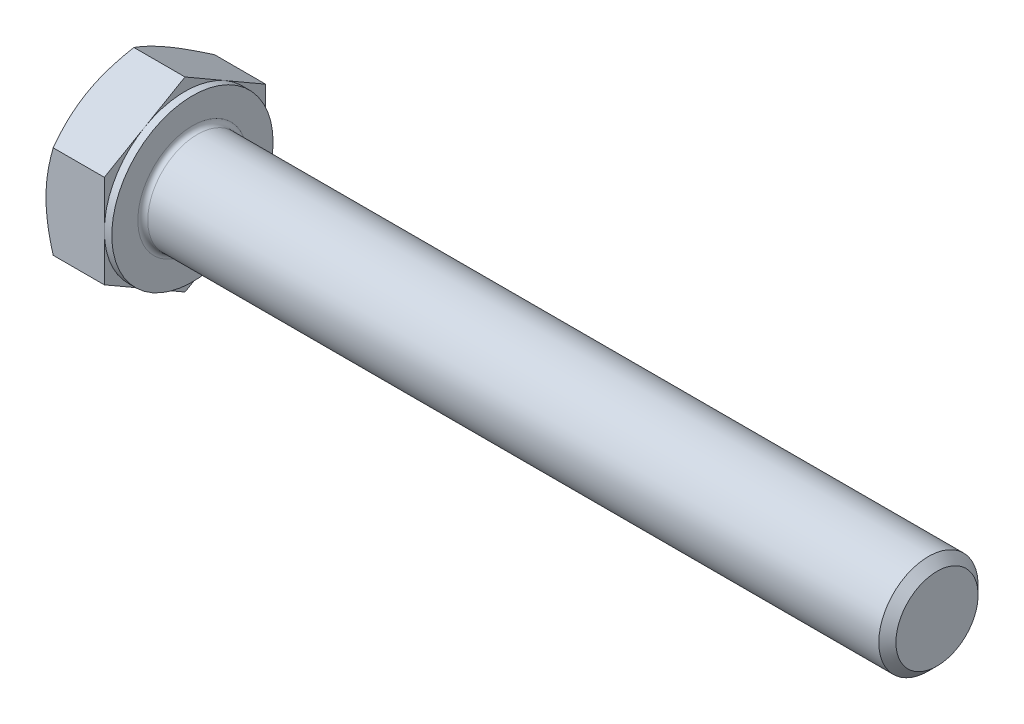
ISO-10303-21;
HEADER;
FILE_DESCRIPTION(('STEP AP214'),'2;1');
FILE_NAME('part.step','',(''),(''),'','','');
FILE_SCHEMA(('AUTOMOTIVE_DESIGN { 1 0 10303 214 1 1 1 1 }'));
ENDSEC;
DATA;
#1=APPLICATION_CONTEXT('core data for automotive mechanical design processes');
#2=APPLICATION_PROTOCOL_DEFINITION('international standard','automotive_design',2000,#1);
#3=PRODUCT_CONTEXT('',#1,'mechanical');
#4=PRODUCT('Part','Part','',(#3));
#5=PRODUCT_RELATED_PRODUCT_CATEGORY('part','',(#4));
#6=PRODUCT_DEFINITION_FORMATION('','',#4);
#7=PRODUCT_DEFINITION_CONTEXT('part definition',#1,'design');
#8=PRODUCT_DEFINITION('design','',#6,#7);
#9=PRODUCT_DEFINITION_SHAPE('','',#8);
#10=(LENGTH_UNIT() NAMED_UNIT(*) SI_UNIT(.MILLI.,.METRE.));
#11=(NAMED_UNIT(*) PLANE_ANGLE_UNIT() SI_UNIT($,.RADIAN.));
#12=(NAMED_UNIT(*) SI_UNIT($,.STERADIAN.) SOLID_ANGLE_UNIT());
#13=UNCERTAINTY_MEASURE_WITH_UNIT(LENGTH_MEASURE(1.E-05),#10,'distance_accuracy_value','');
#14=(GEOMETRIC_REPRESENTATION_CONTEXT(3) GLOBAL_UNCERTAINTY_ASSIGNED_CONTEXT((#13)) GLOBAL_UNIT_ASSIGNED_CONTEXT((#10,
#11,#12)) REPRESENTATION_CONTEXT('',''));
#15=CARTESIAN_POINT('',(0.,0.,0.));
#16=DIRECTION('',(0.,0.,1.));
#17=DIRECTION('',(1.,0.,0.));
#18=AXIS2_PLACEMENT_3D('',#15,#16,#17);
#19=CARTESIAN_POINT('',(5.3,7.50555349946514,0.));
#20=DIRECTION('',(1.,0.,0.));
#21=DIRECTION('',(0.,0.,-1.));
#22=AXIS2_PLACEMENT_3D('',#19,#20,#21);
#23=PLANE('',#22);
#24=CARTESIAN_POINT('',(5.3,0.,0.));
#25=DIRECTION('',(1.,0.,0.));
#26=DIRECTION('',(0.,0.,-1.));
#27=AXIS2_PLACEMENT_3D('',#24,#25,#26);
#28=CIRCLE('',#27,4.4);
#29=CARTESIAN_POINT('',(5.3,0.,-4.4));
#30=VERTEX_POINT('',#29);
#31=EDGE_CURVE('E42',#30,#30,#28,.F.);
#32=ORIENTED_EDGE('',*,*,#31,.T.);
#33=EDGE_LOOP('',(#32));
#34=FACE_BOUND('',#33,.T.);
#35=CARTESIAN_POINT('',(5.3,0.,0.));
#36=DIRECTION('',(1.,0.,0.));
#37=DIRECTION('',(0.,0.,-1.));
#38=AXIS2_PLACEMENT_3D('',#35,#36,#37);
#39=CIRCLE('',#38,6.5);
#40=CARTESIAN_POINT('',(5.3,0.,-6.5));
#41=VERTEX_POINT('',#40);
#42=EDGE_CURVE('E299',#41,#41,#39,.T.);
#43=ORIENTED_EDGE('',*,*,#42,.T.);
#44=EDGE_LOOP('',(#43));
#45=FACE_BOUND('',#44,.T.);
#46=ADVANCED_FACE('F34',(#34,#45),#23,.T.);
#47=CARTESIAN_POINT('',(0.,0.,0.));
#48=DIRECTION('',(-1.,0.,0.));
#49=DIRECTION('',(0.,0.,1.));
#50=AXIS2_PLACEMENT_3D('',#47,#48,#49);
#51=CYLINDRICAL_SURFACE('',#50,4.);
#52=CARTESIAN_POINT('',(5.7,0.,0.));
#53=DIRECTION('',(1.,0.,0.));
#54=DIRECTION('',(0.,0.,-1.));
#55=AXIS2_PLACEMENT_3D('',#52,#53,#54);
#56=CIRCLE('',#55,4.);
#57=CARTESIAN_POINT('',(5.7,0.,-4.));
#58=VERTEX_POINT('',#57);
#59=EDGE_CURVE('E11',#58,#58,#56,.T.);
#60=ORIENTED_EDGE('',*,*,#59,.T.);
#61=EDGE_LOOP('',(#60));
#62=FACE_BOUND('',#61,.T.);
#63=CARTESIAN_POINT('',(64.6095,0.,0.));
#64=DIRECTION('',(-1.,0.,0.));
#65=DIRECTION('',(0.,0.,1.));
#66=AXIS2_PLACEMENT_3D('',#63,#64,#65);
#67=CIRCLE('',#66,4.);
#68=CARTESIAN_POINT('',(64.6095,0.,4.));
#69=VERTEX_POINT('',#68);
#70=EDGE_CURVE('E278',#69,#69,#67,.T.);
#71=ORIENTED_EDGE('',*,*,#70,.T.);
#72=EDGE_LOOP('',(#71));
#73=FACE_BOUND('',#72,.T.);
#74=ADVANCED_FACE('F252',(#62,#73),#51,.T.);
#75=CARTESIAN_POINT('',(65.3,0.,0.));
#76=DIRECTION('',(-1.,0.,0.));
#77=DIRECTION('',(0.,0.,1.));
#78=AXIS2_PLACEMENT_3D('',#75,#76,#77);
#79=CONICAL_SURFACE('',#78,3.3095,0.785398163397461);
#80=ORIENTED_EDGE('',*,*,#70,.F.);
#81=EDGE_LOOP('',(#80));
#82=FACE_BOUND('',#81,.T.);
#83=CARTESIAN_POINT('',(65.3,0.,0.));
#84=DIRECTION('',(-1.,0.,0.));
#85=DIRECTION('',(0.,0.,1.));
#86=AXIS2_PLACEMENT_3D('',#83,#84,#85);
#87=CIRCLE('',#86,3.3095);
#88=CARTESIAN_POINT('',(65.3,0.,3.3095));
#89=VERTEX_POINT('',#88);
#90=EDGE_CURVE('E276',#89,#89,#87,.T.);
#91=ORIENTED_EDGE('',*,*,#90,.T.);
#92=EDGE_LOOP('',(#91));
#93=FACE_BOUND('',#92,.T.);
#94=ADVANCED_FACE('F257',(#82,#93),#79,.T.);
#95=CARTESIAN_POINT('',(65.3,0.,0.));
#96=DIRECTION('',(-1.,0.,0.));
#97=DIRECTION('',(0.,0.,1.));
#98=AXIS2_PLACEMENT_3D('',#95,#96,#97);
#99=PLANE('',#98);
#100=ORIENTED_EDGE('',*,*,#90,.F.);
#101=EDGE_LOOP('',(#100));
#102=FACE_BOUND('',#101,.T.);
#103=ADVANCED_FACE('F264',(#102),#99,.F.);
#104=CARTESIAN_POINT('',(4.7,6.5,0.));
#105=DIRECTION('',(1.,0.,0.));
#106=DIRECTION('',(0.,0.,-1.));
#107=AXIS2_PLACEMENT_3D('',#104,#105,#106);
#108=PLANE('',#107);
#109=DIRECTION('',(0.,0.500000000000001,0.866025403784438));
#110=VECTOR('',#109,1.);
#111=CARTESIAN_POINT('',(4.7,3.75277674973256,-6.5));
#112=LINE('',#111,#110);
#113=CARTESIAN_POINT('',(4.7,3.75277674973256,-6.5));
#114=VERTEX_POINT('',#113);
#115=CARTESIAN_POINT('',(4.7,5.62916512459885,-3.25000000000001));
#116=VERTEX_POINT('',#115);
#117=EDGE_CURVE('E166',#114,#116,#112,.T.);
#118=ORIENTED_EDGE('',*,*,#117,.T.);
#119=CARTESIAN_POINT('',(4.7,0.,0.));
#120=DIRECTION('',(-1.,0.,0.));
#121=DIRECTION('',(0.,0.,1.));
#122=AXIS2_PLACEMENT_3D('',#119,#120,#121);
#123=CIRCLE('',#122,6.5);
#124=CARTESIAN_POINT('',(4.7,0.,-6.5));
#125=VERTEX_POINT('',#124);
#126=EDGE_CURVE('E49',#116,#125,#123,.T.);
#127=ORIENTED_EDGE('',*,*,#126,.T.);
#128=DIRECTION('',(0.,1.,0.));
#129=VECTOR('',#128,1.);
#130=CARTESIAN_POINT('',(4.7,3.75277674973256,-6.5));
#131=LINE('',#130,#129);
#132=EDGE_CURVE('E302',#125,#114,#131,.T.);
#133=ORIENTED_EDGE('',*,*,#132,.T.);
#134=EDGE_LOOP('',(#118,#127,#133));
#135=FACE_BOUND('',#134,.T.);
#136=ADVANCED_FACE('F267',(#135),#108,.T.);
#137=CARTESIAN_POINT('',(4.7,7.50555349946514,0.));
#138=VERTEX_POINT('',#137);
#139=EDGE_CURVE('E164',#116,#138,#112,.T.);
#140=ORIENTED_EDGE('',*,*,#139,.T.);
#141=DIRECTION('',(0.,-0.500000000000001,0.866025403784438));
#142=VECTOR('',#141,1.);
#143=CARTESIAN_POINT('',(4.7,7.50555349946514,0.));
#144=LINE('',#143,#142);
#145=CARTESIAN_POINT('',(4.7,5.62916512459885,3.25000000000001));
#146=VERTEX_POINT('',#145);
#147=EDGE_CURVE('E163',#138,#146,#144,.T.);
#148=ORIENTED_EDGE('',*,*,#147,.T.);
#149=EDGE_CURVE('E152',#146,#116,#123,.T.);
#150=ORIENTED_EDGE('',*,*,#149,.T.);
#151=EDGE_LOOP('',(#140,#148,#150));
#152=FACE_BOUND('',#151,.T.);
#153=ADVANCED_FACE('F272',(#152),#108,.T.);
#154=CARTESIAN_POINT('',(4.7,3.75277674973256,6.5));
#155=VERTEX_POINT('',#154);
#156=EDGE_CURVE('E131',#146,#155,#144,.T.);
#157=ORIENTED_EDGE('',*,*,#156,.T.);
#158=DIRECTION('',(0.,-1.,0.));
#159=VECTOR('',#158,1.);
#160=CARTESIAN_POINT('',(4.7,3.75277674973256,6.5));
#161=LINE('',#160,#159);
#162=CARTESIAN_POINT('',(4.7,0.,6.5));
#163=VERTEX_POINT('',#162);
#164=EDGE_CURVE('E125',#155,#163,#161,.T.);
#165=ORIENTED_EDGE('',*,*,#164,.T.);
#166=EDGE_CURVE('E129',#163,#146,#123,.T.);
#167=ORIENTED_EDGE('',*,*,#166,.T.);
#168=EDGE_LOOP('',(#157,#165,#167));
#169=FACE_BOUND('',#168,.T.);
#170=ADVANCED_FACE('F127',(#169),#108,.T.);
#171=CARTESIAN_POINT('',(4.7,-3.75277674973255,6.5));
#172=VERTEX_POINT('',#171);
#173=EDGE_CURVE('E135',#163,#172,#161,.T.);
#174=ORIENTED_EDGE('',*,*,#173,.T.);
#175=DIRECTION('',(0.,-0.500000000000002,-0.866025403784437));
#176=VECTOR('',#175,1.);
#177=CARTESIAN_POINT('',(4.7,-7.50555349946514,0.));
#178=LINE('',#177,#176);
#179=CARTESIAN_POINT('',(4.7,-5.62916512459885,3.25000000000001));
#180=VERTEX_POINT('',#179);
#181=EDGE_CURVE('E142',#172,#180,#178,.T.);
#182=ORIENTED_EDGE('',*,*,#181,.T.);
#183=EDGE_CURVE('E139',#180,#163,#123,.T.);
#184=ORIENTED_EDGE('',*,*,#183,.T.);
#185=EDGE_LOOP('',(#174,#182,#184));
#186=FACE_BOUND('',#185,.T.);
#187=ADVANCED_FACE('F140',(#186),#108,.T.);
#188=CARTESIAN_POINT('',(4.7,-7.50555349946514,0.));
#189=VERTEX_POINT('',#188);
#190=EDGE_CURVE('E158',#180,#189,#178,.T.);
#191=ORIENTED_EDGE('',*,*,#190,.T.);
#192=DIRECTION('',(0.,0.5,-0.866025403784439));
#193=VECTOR('',#192,1.);
#194=CARTESIAN_POINT('',(4.7,-3.75277674973257,-6.5));
#195=LINE('',#194,#193);
#196=CARTESIAN_POINT('',(4.7,-5.62916512459885,-3.25));
#197=VERTEX_POINT('',#196);
#198=EDGE_CURVE('E340',#189,#197,#195,.T.);
#199=ORIENTED_EDGE('',*,*,#198,.T.);
#200=EDGE_CURVE('E146',#197,#180,#123,.T.);
#201=ORIENTED_EDGE('',*,*,#200,.T.);
#202=EDGE_LOOP('',(#191,#199,#201));
#203=FACE_BOUND('',#202,.T.);
#204=ADVANCED_FACE('F341',(#203),#108,.T.);
#205=CARTESIAN_POINT('',(4.7,-3.75277674973257,-6.5));
#206=VERTEX_POINT('',#205);
#207=EDGE_CURVE('E153',#197,#206,#195,.T.);
#208=ORIENTED_EDGE('',*,*,#207,.T.);
#209=EDGE_CURVE('E303',#206,#125,#131,.T.);
#210=ORIENTED_EDGE('',*,*,#209,.T.);
#211=EDGE_CURVE('E310',#125,#197,#123,.T.);
#212=ORIENTED_EDGE('',*,*,#211,.T.);
#213=EDGE_LOOP('',(#208,#210,#212));
#214=FACE_BOUND('',#213,.T.);
#215=ADVANCED_FACE('F273',(#214),#108,.T.);
#216=CARTESIAN_POINT('',(0.,0.,0.));
#217=DIRECTION('',(-1.,0.,0.));
#218=DIRECTION('',(0.,0.,1.));
#219=AXIS2_PLACEMENT_3D('',#216,#217,#218);
#220=CYLINDRICAL_SURFACE('',#219,6.5);
#221=ORIENTED_EDGE('',*,*,#126,.F.);
#222=ORIENTED_EDGE('',*,*,#149,.F.);
#223=ORIENTED_EDGE('',*,*,#166,.F.);
#224=ORIENTED_EDGE('',*,*,#183,.F.);
#225=ORIENTED_EDGE('',*,*,#200,.F.);
#226=ORIENTED_EDGE('',*,*,#211,.F.);
#227=EDGE_LOOP('',(#221,#222,#223,#224,#225,#226));
#228=FACE_BOUND('',#227,.T.);
#229=ORIENTED_EDGE('',*,*,#42,.F.);
#230=EDGE_LOOP('',(#229));
#231=FACE_BOUND('',#230,.T.);
#232=ADVANCED_FACE('F149',(#228,#231),#220,.T.);
#233=CARTESIAN_POINT('',(0.,7.50555349946514,0.));
#234=DIRECTION('',(1.,0.,0.));
#235=DIRECTION('',(0.,0.,-1.));
#236=AXIS2_PLACEMENT_3D('',#233,#234,#235);
#237=PLANE('',#236);
#238=CARTESIAN_POINT('',(0.,0.,0.));
#239=DIRECTION('',(1.,0.,0.));
#240=DIRECTION('',(0.,0.,-1.));
#241=AXIS2_PLACEMENT_3D('',#238,#239,#240);
#242=CIRCLE('',#241,6.5);
#243=CARTESIAN_POINT('',(0.,0.,-6.5));
#244=VERTEX_POINT('',#243);
#245=CARTESIAN_POINT('',(0.,5.62916512459885,-3.25000000000001));
#246=VERTEX_POINT('',#245);
#247=EDGE_CURVE('E298',#244,#246,#242,.T.);
#248=ORIENTED_EDGE('',*,*,#247,.F.);
#249=CARTESIAN_POINT('',(0.,-5.62916512459885,-3.25));
#250=VERTEX_POINT('',#249);
#251=EDGE_CURVE('E294',#250,#244,#242,.T.);
#252=ORIENTED_EDGE('',*,*,#251,.F.);
#253=CARTESIAN_POINT('',(0.,-5.62916512459884,3.25000000000001));
#254=VERTEX_POINT('',#253);
#255=EDGE_CURVE('E297',#254,#250,#242,.T.);
#256=ORIENTED_EDGE('',*,*,#255,.F.);
#257=CARTESIAN_POINT('',(0.,0.,6.5));
#258=VERTEX_POINT('',#257);
#259=EDGE_CURVE('E333',#258,#254,#242,.T.);
#260=ORIENTED_EDGE('',*,*,#259,.F.);
#261=CARTESIAN_POINT('',(0.,0.,0.));
#262=DIRECTION('',(-1.,0.,0.));
#263=DIRECTION('',(0.,0.,1.));
#264=AXIS2_PLACEMENT_3D('',#261,#262,#263);
#265=CIRCLE('',#264,6.5);
#266=CARTESIAN_POINT('',(0.,5.62916512459885,3.25000000000001));
#267=VERTEX_POINT('',#266);
#268=EDGE_CURVE('E167',#258,#267,#265,.T.);
#269=ORIENTED_EDGE('',*,*,#268,.T.);
#270=EDGE_CURVE('E356',#246,#267,#242,.T.);
#271=ORIENTED_EDGE('',*,*,#270,.F.);
#272=EDGE_LOOP('',(#248,#252,#256,#260,#269,#271));
#273=FACE_BOUND('',#272,.T.);
#274=ADVANCED_FACE('F198',(#273),#237,.F.);
#275=CARTESIAN_POINT('',(0.,0.,0.));
#276=DIRECTION('',(1.,0.,0.));
#277=DIRECTION('',(0.,0.,-1.));
#278=AXIS2_PLACEMENT_3D('',#275,#276,#277);
#279=CONICAL_SURFACE('',#278,6.5,1.0471975511966);
#280=CARTESIAN_POINT('',(0.580623251805864,3.75266127967872,6.5002));
#281=CARTESIAN_POINT('',(0.533004423075482,3.8351516191275,6.35732254094112));
#282=CARTESIAN_POINT('',(0.487546700602703,3.91794952254312,6.21391236546509));
#283=CARTESIAN_POINT('',(0.401548682023043,4.08421773795794,5.9259273686828));
#284=CARTESIAN_POINT('',(0.361010507228023,4.16768832359105,5.78135207342874));
#285=CARTESIAN_POINT('',(0.247571001123207,4.41943655294051,5.34531134947997));
#286=CARTESIAN_POINT('',(0.183047807128738,4.58870793403689,5.05212471715368));
#287=CARTESIAN_POINT('',(0.10738658354749,4.84201947708215,4.61337625445563));
#288=CARTESIAN_POINT('',(0.0858328564569865,4.92530276780316,4.46912536350531));
#289=CARTESIAN_POINT('',(0.0496903146061183,5.09224566542477,4.17997178286191));
#290=CARTESIAN_POINT('',(0.0351008844596661,5.17590523841627,4.03506915190111));
#291=CARTESIAN_POINT('',(0.0132587525073464,5.34336968579963,3.74501222057168));
#292=CARTESIAN_POINT('',(0.00599772432210747,5.427174286676,3.59985839394579));
#293=CARTESIAN_POINT('',(-0.00103969741776898,5.59485627940483,3.30942466302505));
#294=CARTESIAN_POINT('',(-0.000816322187795746,5.6787336689286,3.16414476276365));
#295=CARTESIAN_POINT('',(0.0100834585151651,5.90853103021317,2.76612405757351));
#296=CARTESIAN_POINT('',(0.0283818178694137,6.05437578112763,2.51351353897243));
#297=CARTESIAN_POINT('',(0.086406341457676,6.34509659313135,2.00997032176432));
#298=CARTESIAN_POINT('',(0.126152338538245,6.48997163178545,1.75903939406692));
#299=CARTESIAN_POINT('',(0.22550590320215,6.78127752911039,1.25448277935568));
#300=CARTESIAN_POINT('',(0.285534425638028,6.92767163007068,1.00092075856409));
#301=CARTESIAN_POINT('',(0.421774992509871,7.21827667013277,0.497578064240956));
#302=CARTESIAN_POINT('',(0.497955034163596,7.36249133098589,0.247790944447037));
#303=CARTESIAN_POINT('',(0.58062325180587,7.50566896951898,-0.000199999999999633));
#304=B_SPLINE_CURVE_WITH_KNOTS('',3,(#280,#281,#282,#283,#284,#285,#286,#287,#288,#289,#290,
#291,#292,#293,#294,#295,#296,#297,#298,#299,#300,#301,#302,#303),.UNSPECIFIED.,.F.,.F.,(4,2,2,
2,2,2,2,2,2,2,2,4),(0.,0.515105052395588,1.03043143507524,2.06322554824262,2.56697389547996,
3.07067772176454,3.57380860368928,4.0769239424252,4.9527935470566,5.82947446853467,
6.72559912449737,7.61996451221046),.UNSPECIFIED.);
#305=CARTESIAN_POINT('',(0.580556583600766,7.50555349946514,0.));
#306=VERTEX_POINT('',#305);
#307=EDGE_CURVE('E218',#267,#306,#304,.T.);
#308=ORIENTED_EDGE('',*,*,#307,.T.);
#309=CARTESIAN_POINT('',(0.58062325180587,7.50566896951898,0.000200000000000209));
#310=CARTESIAN_POINT('',(0.533004423075488,7.4231786300702,-0.14267745905888));
#311=CARTESIAN_POINT('',(0.487546700602709,7.34038072665459,-0.286087634534912));
#312=CARTESIAN_POINT('',(0.401548682023048,7.17411251123976,-0.574072631317194));
#313=CARTESIAN_POINT('',(0.361010507228028,7.09064192560666,-0.718647926571263));
#314=CARTESIAN_POINT('',(0.247571001123211,6.83889369625719,-1.15468865052003));
#315=CARTESIAN_POINT('',(0.183047807128741,6.66962231516081,-1.44787528284632));
#316=CARTESIAN_POINT('',(0.107386583547493,6.41631077211555,-1.88662374554437));
#317=CARTESIAN_POINT('',(0.0858328564569886,6.33302748139454,-2.03087463649469));
#318=CARTESIAN_POINT('',(0.0496903146061198,6.16608458377293,-2.32002821713809));
#319=CARTESIAN_POINT('',(0.0351008844596674,6.08242501078143,-2.46493084809889));
#320=CARTESIAN_POINT('',(0.0132587525073474,5.91496056339807,-2.75498777942832));
#321=CARTESIAN_POINT('',(0.00599772432210818,5.8311559625217,-2.90014160605421));
#322=CARTESIAN_POINT('',(-0.00103969741776867,5.66347396979287,-3.19057533697495));
#323=CARTESIAN_POINT('',(-0.000816322187795643,5.5795965802691,-3.33585523723636));
#324=CARTESIAN_POINT('',(0.0100834585151646,5.34979921898453,-3.73387594242649));
#325=CARTESIAN_POINT('',(0.0283818178694127,5.20395446807007,-3.98648646102757));
#326=CARTESIAN_POINT('',(0.0864063414576741,4.91323365606635,-4.49002967823568));
#327=CARTESIAN_POINT('',(0.126152338538243,4.76835861741226,-4.74096060593308));
#328=CARTESIAN_POINT('',(0.225505903202148,4.47705272008731,-5.24551722064432));
#329=CARTESIAN_POINT('',(0.285534425638024,4.33065861912702,-5.49907924143591));
#330=CARTESIAN_POINT('',(0.421774992509866,4.04005357906493,-6.00242193575904));
#331=CARTESIAN_POINT('',(0.49795503416359,3.89583891821181,-6.25220905555296));
#332=CARTESIAN_POINT('',(0.580623251805864,3.75266127967872,-6.5002));
#333=B_SPLINE_CURVE_WITH_KNOTS('',3,(#309,#310,#311,#312,#313,#314,#315,#316,#317,#318,#319,
#320,#321,#322,#323,#324,#325,#326,#327,#328,#329,#330,#331,#332),.UNSPECIFIED.,.F.,.F.,(4,2,2,
2,2,2,2,2,2,2,2,4),(0.,0.515105052395588,1.03043143507525,2.06322554824262,2.56697389547997,
3.07067772176454,3.57380860368928,4.0769239424252,4.9527935470566,5.82947446853467,
6.72559912449737,7.61996451221046),.UNSPECIFIED.);
#334=EDGE_CURVE('E57',#306,#246,#333,.T.);
#335=ORIENTED_EDGE('',*,*,#334,.T.);
#336=ORIENTED_EDGE('',*,*,#270,.T.);
#337=EDGE_LOOP('',(#308,#335,#336));
#338=FACE_BOUND('',#337,.T.);
#339=ADVANCED_FACE('F357',(#338),#279,.T.);
#340=CARTESIAN_POINT('',(3.18835311590245,-10.1137456678934,6.5));
#341=CARTESIAN_POINT('',(3.05034774010467,-9.82952666322135,6.5));
#342=CARTESIAN_POINT('',(2.91365616489937,-9.54465869649271,6.5));
#343=CARTESIAN_POINT('',(2.6436389949754,-8.97327978057919,6.5));
#344=CARTESIAN_POINT('',(2.51031392459096,-8.6867685838847,6.5));
#345=CARTESIAN_POINT('',(2.24710473482718,-8.11029837842687,6.5));
#346=CARTESIAN_POINT('',(2.11724300438679,-7.82032911201509,6.5));
#347=CARTESIAN_POINT('',(1.86279082826902,-7.23809541022337,6.5));
#348=CARTESIAN_POINT('',(1.73820013554673,-6.94583108317205,6.5));
#349=CARTESIAN_POINT('',(1.49176685426961,-6.34906440963034,6.5));
#350=CARTESIAN_POINT('',(1.37014257641265,-6.0444714228887,6.5));
#351=CARTESIAN_POINT('',(1.13601865758149,-5.43173420957314,6.5));
#352=CARTESIAN_POINT('',(1.02352003558022,-5.12358959079844,6.5));
#353=CARTESIAN_POINT('',(0.810575368239912,-4.50382569782258,6.5));
#354=CARTESIAN_POINT('',(0.710105232302001,-4.19221478266991,6.5));
#355=CARTESIAN_POINT('',(0.52442016614445,-3.5645201920601,6.5));
#356=CARTESIAN_POINT('',(0.439200468206413,-3.24843794792919,6.5));
#357=CARTESIAN_POINT('',(0.288524223401193,-2.61335465712781,6.5));
#358=CARTESIAN_POINT('',(0.222961865744745,-2.29437912059503,6.5));
#359=CARTESIAN_POINT('',(0.115312883130723,-1.65238219405861,6.5));
#360=CARTESIAN_POINT('',(0.0732239014690617,-1.32936121354428,6.5));
#361=CARTESIAN_POINT('',(0.0304887136381655,-0.845231171839969,6.5));
#362=CARTESIAN_POINT('',(0.0196493434273836,-0.684982209663087,6.5));
#363=CARTESIAN_POINT('',(0.00475298486143957,-0.364162349065444,6.5));
#364=CARTESIAN_POINT('',(0.000695882908831814,-0.203591456081864,6.5));
#365=CARTESIAN_POINT('',(-0.000531597190094771,0.117577430374312,6.5));
#366=CARTESIAN_POINT('',(0.00229809017012764,0.278175424090158,6.5));
#367=CARTESIAN_POINT('',(0.0147726845547652,0.59910897282352,6.5));
#368=CARTESIAN_POINT('',(0.0244179260500531,0.759444514574232,6.5));
#369=CARTESIAN_POINT('',(0.0554961939343018,1.14369946602535,6.5));
#370=CARTESIAN_POINT('',(0.080103049051454,1.36736763045088,6.5));
#371=CARTESIAN_POINT('',(0.141246537453381,1.81305591311689,6.5));
#372=CARTESIAN_POINT('',(0.177784759614455,2.0350758078311,6.5));
#373=CARTESIAN_POINT('',(0.30336000133212,2.69839633433798,6.5));
#374=CARTESIAN_POINT('',(0.4083358151476,3.13672010374359,6.5));
#375=CARTESIAN_POINT('',(0.590564593134947,3.7923211291812,6.5));
#376=CARTESIAN_POINT('',(0.656313198979099,4.01299150874075,6.5));
#377=CARTESIAN_POINT('',(0.79468163420074,4.45218859008393,6.5));
#378=CARTESIAN_POINT('',(0.867301513122626,4.67071527639821,6.5));
#379=CARTESIAN_POINT('',(1.01824353854296,5.10569490252729,6.5));
#380=CARTESIAN_POINT('',(1.0965638823284,5.32214847365078,6.5));
#381=CARTESIAN_POINT('',(1.25798086164822,5.75325725773041,6.5));
#382=CARTESIAN_POINT('',(1.34107741035996,5.96791250329559,6.5));
#383=CARTESIAN_POINT('',(1.56029019583042,6.51888445936375,6.5));
#384=CARTESIAN_POINT('',(1.69936356666535,6.85402316813629,6.5));
#385=CARTESIAN_POINT('',(1.98501958087354,7.52109583939395,6.5));
#386=CARTESIAN_POINT('',(2.13160288780792,7.85302951559935,6.5));
#387=CARTESIAN_POINT('',(2.43059748044952,8.5143786551866,6.5));
#388=CARTESIAN_POINT('',(2.5830105759696,8.84379329784096,6.5));
#389=CARTESIAN_POINT('',(2.89234869374927,9.50047798683786,6.5));
#390=CARTESIAN_POINT('',(3.04927357220059,9.82774810112759,6.5));
#391=CARTESIAN_POINT('',(3.36692013130637,10.4809971975748,6.5));
#392=CARTESIAN_POINT('',(3.52764676491734,10.8069737667408,6.5));
#393=CARTESIAN_POINT('',(3.851985555549,11.4574882901034,6.5));
#394=CARTESIAN_POINT('',(4.01559773123066,11.7820262349792,6.5));
#395=CARTESIAN_POINT('',(4.50986185003774,12.7537468114441,6.5));
#396=CARTESIAN_POINT('',(4.84399997978541,13.3991555932469,6.5));
#397=CARTESIAN_POINT('',(5.48575990265919,14.6239779290894,6.5));
#398=CARTESIAN_POINT('',(5.79279643372278,15.2036995760604,6.5));
#399=CARTESIAN_POINT('',(6.4106918822763,16.3611382637875,6.5));
#400=CARTESIAN_POINT('',(6.72155099010109,16.938855202873,6.5));
#401=CARTESIAN_POINT('',(7.34519775439014,18.0910273555999,6.5));
#402=CARTESIAN_POINT('',(7.65797694168864,18.665487160613,6.5));
#403=CARTESIAN_POINT('',(8.28574397153078,19.8131486204439,6.5));
#404=CARTESIAN_POINT('',(8.60073166294278,20.3863503578957,6.5));
#405=CARTESIAN_POINT('',(8.91652967168741,20.9591024521448,6.5));
#406=B_SPLINE_CURVE_WITH_KNOTS('',3,(#340,#341,#342,#343,#344,#345,#346,#347,#348,#349,#350,
#351,#352,#353,#354,#355,#356,#357,#358,#359,#360,#361,#362,#363,#364,#365,#366,#367,#368,#369,
#370,#371,#372,#373,#374,#375,#376,#377,#378,#379,#380,#381,#382,#383,#384,#385,#386,#387,#388,
#389,#390,#391,#392,#393,#394,#395,#396,#397,#398,#399,#400,#401,#402,#403,#404,#405),
.UNSPECIFIED.,.F.,.F.,(4,2,2,2,2,2,2,2,2,2,2,2,2,2,2,2,2,2,2,2,2,2,2,2,2,2,2,2,2,2,2,2,4),(0.,
0.947868666702312,1.89588406483492,2.84900320930536,3.80207763304314,4.7858977408271,
5.76982755141751,6.75175256246684,7.73337005764393,8.7096047489099,9.68574140951123,
10.1674651053568,10.6491807326436,11.1309009419855,11.6126447932157,12.287317572382,
12.9620802330383,14.312318438093,15.0030310344276,15.6937486114326,16.3842486973571,
17.0747362352244,18.1631508683747,19.2516618378194,20.3405135142583,21.4293305231019,
22.5196540547636,23.6099846401957,25.7902468235016,27.7582608872417,29.7263733429304,
31.6886408595598,33.6507753806319),.UNSPECIFIED.);
#407=CARTESIAN_POINT('',(0.58055658360076,3.75277674973256,6.5));
#408=VERTEX_POINT('',#407);
#409=EDGE_CURVE('E232',#258,#408,#406,.T.);
#410=ORIENTED_EDGE('',*,*,#409,.T.);
#411=EDGE_CURVE('E231',#408,#267,#304,.T.);
#412=ORIENTED_EDGE('',*,*,#411,.T.);
#413=ORIENTED_EDGE('',*,*,#268,.F.);
#414=EDGE_LOOP('',(#410,#412,#413));
#415=FACE_BOUND('',#414,.T.);
#416=ADVANCED_FACE('F327',(#415),#279,.T.);
#417=CARTESIAN_POINT('',(0.580556583600759,-3.75277674973256,6.5));
#418=VERTEX_POINT('',#417);
#419=EDGE_CURVE('E279',#418,#258,#406,.T.);
#420=ORIENTED_EDGE('',*,*,#419,.T.);
#421=ORIENTED_EDGE('',*,*,#259,.T.);
#422=CARTESIAN_POINT('',(0.58062325180587,-7.50566896951898,-0.000200000000000067));
#423=CARTESIAN_POINT('',(0.533004423075488,-7.4231786300702,0.14267745905888));
#424=CARTESIAN_POINT('',(0.487546700602709,-7.34038072665459,0.286087634534913));
#425=CARTESIAN_POINT('',(0.401548682023048,-7.17411251123976,0.574072631317194));
#426=CARTESIAN_POINT('',(0.361010507228027,-7.09064192560665,0.718647926571264));
#427=CARTESIAN_POINT('',(0.24757100112321,-6.83889369625719,1.15468865052003));
#428=CARTESIAN_POINT('',(0.18304780712874,-6.66962231516081,1.44787528284632));
#429=CARTESIAN_POINT('',(0.107386583547492,-6.41631077211555,1.88662374554437));
#430=CARTESIAN_POINT('',(0.0858328564569879,-6.33302748139454,2.03087463649469));
#431=CARTESIAN_POINT('',(0.0496903146061189,-6.16608458377293,2.32002821713809));
#432=CARTESIAN_POINT('',(0.035100884459666,-6.08242501078143,2.46493084809889));
#433=CARTESIAN_POINT('',(0.0132587525073457,-5.91496056339806,2.75498777942832));
#434=CARTESIAN_POINT('',(0.00599772432210683,-5.8311559625217,2.90014160605421));
#435=CARTESIAN_POINT('',(-0.00103969741776984,-5.66347396979287,3.19057533697495));
#436=CARTESIAN_POINT('',(-0.000816322187796888,-5.5795965802691,3.33585523723636));
#437=CARTESIAN_POINT('',(0.010083458515163,-5.34979921898453,3.73387594242649));
#438=CARTESIAN_POINT('',(0.0283818178694106,-5.20395446807006,3.98648646102757));
#439=CARTESIAN_POINT('',(0.0864063414576717,-4.91323365606635,4.49002967823568));
#440=CARTESIAN_POINT('',(0.126152338538241,-4.76835861741225,4.74096060593308));
#441=CARTESIAN_POINT('',(0.225505903202145,-4.47705272008731,5.24551722064432));
#442=CARTESIAN_POINT('',(0.285534425638022,-4.33065861912702,5.49907924143591));
#443=CARTESIAN_POINT('',(0.421774992509864,-4.04005357906492,6.00242193575904));
#444=CARTESIAN_POINT('',(0.497955034163589,-3.8958389182118,6.25220905555296));
#445=CARTESIAN_POINT('',(0.580623251805863,-3.75266127967872,6.5002));
#446=B_SPLINE_CURVE_WITH_KNOTS('',3,(#422,#423,#424,#425,#426,#427,#428,#429,#430,#431,#432,
#433,#434,#435,#436,#437,#438,#439,#440,#441,#442,#443,#444,#445),.UNSPECIFIED.,.F.,.F.,(4,2,2,
2,2,2,2,2,2,2,2,4),(0.,0.515105052395588,1.03043143507525,2.06322554824262,2.56697389547996,
3.07067772176454,3.57380860368928,4.0769239424252,4.9527935470566,5.82947446853467,
6.72559912449737,7.61996451221046),.UNSPECIFIED.);
#447=EDGE_CURVE('E220',#254,#418,#446,.T.);
#448=ORIENTED_EDGE('',*,*,#447,.T.);
#449=EDGE_LOOP('',(#420,#421,#448));
#450=FACE_BOUND('',#449,.T.);
#451=ADVANCED_FACE('F187',(#450),#279,.T.);
#452=CARTESIAN_POINT('',(0.580556583600766,-7.50555349946514,0.));
#453=VERTEX_POINT('',#452);
#454=EDGE_CURVE('E212',#453,#254,#446,.T.);
#455=ORIENTED_EDGE('',*,*,#454,.T.);
#456=ORIENTED_EDGE('',*,*,#255,.T.);
#457=CARTESIAN_POINT('',(0.580623251805868,-3.75266127967874,-6.5002));
#458=CARTESIAN_POINT('',(0.533004423075487,-3.83515161912751,-6.35732254094112));
#459=CARTESIAN_POINT('',(0.487546700602708,-3.91794952254313,-6.21391236546509));
#460=CARTESIAN_POINT('',(0.401548682023047,-4.08421773795795,-5.9259273686828));
#461=CARTESIAN_POINT('',(0.361010507228027,-4.16768832359106,-5.78135207342874));
#462=CARTESIAN_POINT('',(0.24757100112321,-4.41943655294052,-5.34531134947996));
#463=CARTESIAN_POINT('',(0.183047807128741,-4.5887079340369,-5.05212471715368));
#464=CARTESIAN_POINT('',(0.107386583547494,-4.84201947708216,-4.61337625445563));
#465=CARTESIAN_POINT('',(0.0858328564569898,-4.92530276780317,-4.46912536350531));
#466=CARTESIAN_POINT('',(0.0496903146061215,-5.09224566542478,-4.17997178286191));
#467=CARTESIAN_POINT('',(0.0351008844596693,-5.17590523841628,-4.03506915190111));
#468=CARTESIAN_POINT('',(0.0132587525073497,-5.34336968579964,-3.74501222057168));
#469=CARTESIAN_POINT('',(0.00599772432211073,-5.42717428667601,-3.59985839394579));
#470=CARTESIAN_POINT('',(-0.00103969741776547,-5.59485627940484,-3.30942466302505));
#471=CARTESIAN_POINT('',(-0.000816322187792015,-5.67873366892861,-3.16414476276364));
#472=CARTESIAN_POINT('',(0.0100834585151689,-5.90853103021318,-2.7661240575735));
#473=CARTESIAN_POINT('',(0.0283818178694168,-6.05437578112764,-2.51351353897243));
#474=CARTESIAN_POINT('',(0.0864063414576785,-6.34509659313135,-2.00997032176432));
#475=CARTESIAN_POINT('',(0.126152338538248,-6.48997163178545,-1.75903939406692));
#476=CARTESIAN_POINT('',(0.225505903202153,-6.78127752911039,-1.25448277935568));
#477=CARTESIAN_POINT('',(0.28553442563803,-6.92767163007068,-1.00092075856409));
#478=CARTESIAN_POINT('',(0.421774992509871,-7.21827667013277,-0.497578064240955));
#479=CARTESIAN_POINT('',(0.497955034163596,-7.36249133098589,-0.247790944447037));
#480=CARTESIAN_POINT('',(0.58062325180587,-7.50566896951898,0.000199999999999619));
#481=B_SPLINE_CURVE_WITH_KNOTS('',3,(#457,#458,#459,#460,#461,#462,#463,#464,#465,#466,#467,
#468,#469,#470,#471,#472,#473,#474,#475,#476,#477,#478,#479,#480),.UNSPECIFIED.,.F.,.F.,(4,2,2,
2,2,2,2,2,2,2,2,4),(0.,0.515105052395587,1.03043143507525,2.06322554824262,2.56697389547996,
3.07067772176454,3.57380860368928,4.0769239424252,4.9527935470566,5.82947446853466,
6.72559912449736,7.61996451221046),.UNSPECIFIED.);
#482=EDGE_CURVE('E219',#250,#453,#481,.T.);
#483=ORIENTED_EDGE('',*,*,#482,.T.);
#484=EDGE_LOOP('',(#455,#456,#483));
#485=FACE_BOUND('',#484,.T.);
#486=ADVANCED_FACE('F355',(#485),#279,.T.);
#487=CARTESIAN_POINT('',(0.58055658360076,3.75277674973256,-6.5));
#488=VERTEX_POINT('',#487);
#489=EDGE_CURVE('E221',#246,#488,#333,.T.);
#490=ORIENTED_EDGE('',*,*,#489,.T.);
#491=CARTESIAN_POINT('',(3.18835311590246,-10.1137456678934,-6.5));
#492=CARTESIAN_POINT('',(3.05034774010468,-9.82952666322138,-6.5));
#493=CARTESIAN_POINT('',(2.91365616489938,-9.54465869649274,-6.5));
#494=CARTESIAN_POINT('',(2.64363899497541,-8.97327978057921,-6.5));
#495=CARTESIAN_POINT('',(2.51031392459097,-8.68676858388472,-6.5));
#496=CARTESIAN_POINT('',(2.24710473482719,-8.11029837842688,-6.5));
#497=CARTESIAN_POINT('',(2.1172430043868,-7.82032911201511,-6.5));
#498=CARTESIAN_POINT('',(1.86279082826903,-7.23809541022339,-6.5));
#499=CARTESIAN_POINT('',(1.73820013554674,-6.94583108317207,-6.5));
#500=CARTESIAN_POINT('',(1.49176685426961,-6.34906440963036,-6.5));
#501=CARTESIAN_POINT('',(1.37014257641265,-6.04447142288872,-6.5));
#502=CARTESIAN_POINT('',(1.13601865758149,-5.43173420957315,-6.5));
#503=CARTESIAN_POINT('',(1.02352003558022,-5.12358959079846,-6.5));
#504=CARTESIAN_POINT('',(0.810575368239917,-4.5038256978226,-6.5));
#505=CARTESIAN_POINT('',(0.710105232302005,-4.19221478266993,-6.5));
#506=CARTESIAN_POINT('',(0.524420166144454,-3.56452019206012,-6.5));
#507=CARTESIAN_POINT('',(0.439200468206418,-3.24843794792921,-6.5));
#508=CARTESIAN_POINT('',(0.288524223401197,-2.61335465712783,-6.5));
#509=CARTESIAN_POINT('',(0.222961865744748,-2.29437912059505,-6.5));
#510=CARTESIAN_POINT('',(0.115312883130725,-1.65238219405862,-6.5));
#511=CARTESIAN_POINT('',(0.0732239014690631,-1.3293612135443,-6.5));
#512=CARTESIAN_POINT('',(0.0304887136381663,-0.845231171839984,-6.5));
#513=CARTESIAN_POINT('',(0.0196493434273842,-0.684982209663101,-6.5));
#514=CARTESIAN_POINT('',(0.00475298486143994,-0.364162349065458,-6.5));
#515=CARTESIAN_POINT('',(0.000695882908832085,-0.203591456081877,-6.5));
#516=CARTESIAN_POINT('',(-0.000531597190095041,0.117577430374299,-6.5));
#517=CARTESIAN_POINT('',(0.00229809017012691,0.278175424090145,-6.5));
#518=CARTESIAN_POINT('',(0.0147726845547639,0.599108972823507,-6.5));
#519=CARTESIAN_POINT('',(0.0244179260500518,0.759444514574219,-6.5));
#520=CARTESIAN_POINT('',(0.0554961939343001,1.14369946602534,-6.5));
#521=CARTESIAN_POINT('',(0.0801030490514518,1.36736763045086,-6.5));
#522=CARTESIAN_POINT('',(0.141246537453378,1.81305591311688,-6.5));
#523=CARTESIAN_POINT('',(0.177784759614452,2.03507580783109,-6.5));
#524=CARTESIAN_POINT('',(0.303360001332116,2.69839633433796,-6.5));
#525=CARTESIAN_POINT('',(0.408335815147596,3.13672010374357,-6.5));
#526=CARTESIAN_POINT('',(0.590564593134941,3.79232112918118,-6.5));
#527=CARTESIAN_POINT('',(0.656313198979092,4.01299150874073,-6.5));
#528=CARTESIAN_POINT('',(0.794681634200732,4.45218859008391,-6.5));
#529=CARTESIAN_POINT('',(0.867301513122618,4.67071527639819,-6.5));
#530=CARTESIAN_POINT('',(1.01824353854295,5.10569490252726,-6.5));
#531=CARTESIAN_POINT('',(1.09656388232839,5.32214847365076,-6.5));
#532=CARTESIAN_POINT('',(1.25798086164821,5.75325725773039,-6.5));
#533=CARTESIAN_POINT('',(1.34107741035995,5.96791250329556,-6.5));
#534=CARTESIAN_POINT('',(1.56029019583041,6.51888445936372,-6.5));
#535=CARTESIAN_POINT('',(1.69936356666534,6.85402316813627,-6.5));
#536=CARTESIAN_POINT('',(1.98501958087353,7.52109583939393,-6.5));
#537=CARTESIAN_POINT('',(2.13160288780791,7.85302951559933,-6.5));
#538=CARTESIAN_POINT('',(2.43059748044951,8.51437865518658,-6.5));
#539=CARTESIAN_POINT('',(2.58301057596959,8.84379329784094,-6.5));
#540=CARTESIAN_POINT('',(2.89234869374927,9.50047798683784,-6.5));
#541=CARTESIAN_POINT('',(3.04927357220059,9.82774810112757,-6.5));
#542=CARTESIAN_POINT('',(3.36692013130636,10.4809971975748,-6.5));
#543=CARTESIAN_POINT('',(3.52764676491733,10.8069737667408,-6.5));
#544=CARTESIAN_POINT('',(3.85198555554899,11.4574882901034,-6.5));
#545=CARTESIAN_POINT('',(4.01559773123066,11.7820262349792,-6.5));
#546=CARTESIAN_POINT('',(4.50986185003774,12.7537468114441,-6.5));
#547=CARTESIAN_POINT('',(4.84399997978541,13.3991555932469,-6.5));
#548=CARTESIAN_POINT('',(5.4857599026592,14.6239779290894,-6.5));
#549=CARTESIAN_POINT('',(5.79279643372279,15.2036995760604,-6.5));
#550=CARTESIAN_POINT('',(6.4106918822763,16.3611382637875,-6.5));
#551=CARTESIAN_POINT('',(6.72155099010109,16.938855202873,-6.5));
#552=CARTESIAN_POINT('',(7.34519775439015,18.0910273555999,-6.5));
#553=CARTESIAN_POINT('',(7.65797694168864,18.665487160613,-6.5));
#554=CARTESIAN_POINT('',(8.28574397153078,19.8131486204439,-6.5));
#555=CARTESIAN_POINT('',(8.60073166294279,20.3863503578957,-6.5));
#556=CARTESIAN_POINT('',(8.91652967168741,20.9591024521449,-6.5));
#557=B_SPLINE_CURVE_WITH_KNOTS('',3,(#491,#492,#493,#494,#495,#496,#497,#498,#499,#500,#501,
#502,#503,#504,#505,#506,#507,#508,#509,#510,#511,#512,#513,#514,#515,#516,#517,#518,#519,#520,
#521,#522,#523,#524,#525,#526,#527,#528,#529,#530,#531,#532,#533,#534,#535,#536,#537,#538,#539,
#540,#541,#542,#543,#544,#545,#546,#547,#548,#549,#550,#551,#552,#553,#554,#555,#556),
.UNSPECIFIED.,.F.,.F.,(4,2,2,2,2,2,2,2,2,2,2,2,2,2,2,2,2,2,2,2,2,2,2,2,2,2,2,2,2,2,2,2,4),(0.,
0.947868666702312,1.89588406483492,2.84900320930536,3.80207763304315,4.78589774082711,
5.76982755141752,6.75175256246685,7.73337005764394,8.70960474890991,9.68574140951124,
10.1674651053568,10.6491807326436,11.1309009419855,11.6126447932157,12.287317572382,
12.9620802330384,14.312318438093,15.0030310344276,15.6937486114326,16.3842486973571,
17.0747362352244,18.1631508683747,19.2516618378194,20.3405135142583,21.4293305231019,
22.5196540547637,23.6099846401957,25.7902468235017,27.7582608872418,29.7263733429304,
31.6886408595598,33.6507753806319),.UNSPECIFIED.);
#558=EDGE_CURVE('E179',#488,#244,#557,.F.);
#559=ORIENTED_EDGE('',*,*,#558,.T.);
#560=ORIENTED_EDGE('',*,*,#247,.T.);
#561=EDGE_LOOP('',(#490,#559,#560));
#562=FACE_BOUND('',#561,.T.);
#563=ADVANCED_FACE('F352',(#562),#279,.T.);
#564=CARTESIAN_POINT('',(0.580556583600764,-3.75277674973257,-6.5));
#565=VERTEX_POINT('',#564);
#566=EDGE_CURVE('E180',#565,#250,#481,.T.);
#567=ORIENTED_EDGE('',*,*,#566,.T.);
#568=ORIENTED_EDGE('',*,*,#251,.T.);
#569=EDGE_CURVE('E170',#244,#565,#557,.F.);
#570=ORIENTED_EDGE('',*,*,#569,.T.);
#571=EDGE_LOOP('',(#567,#568,#570));
#572=FACE_BOUND('',#571,.T.);
#573=ADVANCED_FACE('F196',(#572),#279,.T.);
#574=CARTESIAN_POINT('',(5.3,3.75277674973256,-6.5));
#575=DIRECTION('',(0.,0.,1.));
#576=DIRECTION('',(0.,-1.,0.));
#577=AXIS2_PLACEMENT_3D('',#574,#575,#576);
#578=PLANE('',#577);
#579=ORIENTED_EDGE('',*,*,#209,.F.);
#580=DIRECTION('',(-1.,0.,0.));
#581=VECTOR('',#580,1.);
#582=CARTESIAN_POINT('',(5.3,-3.75277674973257,-6.5));
#583=LINE('',#582,#581);
#584=EDGE_CURVE('E285',#206,#565,#583,.T.);
#585=ORIENTED_EDGE('',*,*,#584,.T.);
#586=ORIENTED_EDGE('',*,*,#569,.F.);
#587=ORIENTED_EDGE('',*,*,#558,.F.);
#588=DIRECTION('',(-1.,0.,0.));
#589=VECTOR('',#588,1.);
#590=CARTESIAN_POINT('',(5.3,3.75277674973256,-6.5));
#591=LINE('',#590,#589);
#592=EDGE_CURVE('E281',#114,#488,#591,.T.);
#593=ORIENTED_EDGE('',*,*,#592,.F.);
#594=ORIENTED_EDGE('',*,*,#132,.F.);
#595=EDGE_LOOP('',(#579,#585,#586,#587,#593,#594));
#596=FACE_BOUND('',#595,.T.);
#597=ADVANCED_FACE('F191',(#596),#578,.F.);
#598=CARTESIAN_POINT('',(5.3,-3.75277674973257,-6.5));
#599=DIRECTION('',(0.,0.866025403784439,0.5));
#600=DIRECTION('',(0.,-0.5,0.866025403784439));
#601=AXIS2_PLACEMENT_3D('',#598,#599,#600);
#602=PLANE('',#601);
#603=ORIENTED_EDGE('',*,*,#198,.F.);
#604=DIRECTION('',(-1.,0.,0.));
#605=VECTOR('',#604,1.);
#606=CARTESIAN_POINT('',(5.3,-7.50555349946514,0.));
#607=LINE('',#606,#605);
#608=EDGE_CURVE('E287',#189,#453,#607,.T.);
#609=ORIENTED_EDGE('',*,*,#608,.T.);
#610=ORIENTED_EDGE('',*,*,#482,.F.);
#611=ORIENTED_EDGE('',*,*,#566,.F.);
#612=ORIENTED_EDGE('',*,*,#584,.F.);
#613=ORIENTED_EDGE('',*,*,#207,.F.);
#614=EDGE_LOOP('',(#603,#609,#610,#611,#612,#613));
#615=FACE_BOUND('',#614,.T.);
#616=ADVANCED_FACE('F195',(#615),#602,.F.);
#617=CARTESIAN_POINT('',(5.3,-7.50555349946514,0.));
#618=DIRECTION('',(0.,0.866025403784438,-0.500000000000002));
#619=DIRECTION('',(0.,0.500000000000002,0.866025403784437));
#620=AXIS2_PLACEMENT_3D('',#617,#618,#619);
#621=PLANE('',#620);
#622=ORIENTED_EDGE('',*,*,#181,.F.);
#623=DIRECTION('',(-1.,0.,0.));
#624=VECTOR('',#623,1.);
#625=CARTESIAN_POINT('',(5.3,-3.75277674973255,6.5));
#626=LINE('',#625,#624);
#627=EDGE_CURVE('E157',#172,#418,#626,.T.);
#628=ORIENTED_EDGE('',*,*,#627,.T.);
#629=ORIENTED_EDGE('',*,*,#447,.F.);
#630=ORIENTED_EDGE('',*,*,#454,.F.);
#631=ORIENTED_EDGE('',*,*,#608,.F.);
#632=ORIENTED_EDGE('',*,*,#190,.F.);
#633=EDGE_LOOP('',(#622,#628,#629,#630,#631,#632));
#634=FACE_BOUND('',#633,.T.);
#635=ADVANCED_FACE('F203',(#634),#621,.F.);
#636=CARTESIAN_POINT('',(5.3,3.75277674973256,6.5));
#637=DIRECTION('',(0.,0.,-1.));
#638=DIRECTION('',(0.,1.,0.));
#639=AXIS2_PLACEMENT_3D('',#636,#637,#638);
#640=PLANE('',#639);
#641=ORIENTED_EDGE('',*,*,#164,.F.);
#642=DIRECTION('',(-1.,0.,0.));
#643=VECTOR('',#642,1.);
#644=CARTESIAN_POINT('',(5.3,3.75277674973256,6.5));
#645=LINE('',#644,#643);
#646=EDGE_CURVE('E290',#155,#408,#645,.T.);
#647=ORIENTED_EDGE('',*,*,#646,.T.);
#648=ORIENTED_EDGE('',*,*,#409,.F.);
#649=ORIENTED_EDGE('',*,*,#419,.F.);
#650=ORIENTED_EDGE('',*,*,#627,.F.);
#651=ORIENTED_EDGE('',*,*,#173,.F.);
#652=EDGE_LOOP('',(#641,#647,#648,#649,#650,#651));
#653=FACE_BOUND('',#652,.T.);
#654=ADVANCED_FACE('F155',(#653),#640,.F.);
#655=CARTESIAN_POINT('',(5.3,7.50555349946514,0.));
#656=DIRECTION('',(0.,-0.866025403784438,-0.500000000000001));
#657=DIRECTION('',(0.,0.500000000000001,-0.866025403784438));
#658=AXIS2_PLACEMENT_3D('',#655,#656,#657);
#659=PLANE('',#658);
#660=ORIENTED_EDGE('',*,*,#147,.F.);
#661=DIRECTION('',(-1.,0.,0.));
#662=VECTOR('',#661,1.);
#663=CARTESIAN_POINT('',(5.3,7.50555349946514,0.));
#664=LINE('',#663,#662);
#665=EDGE_CURVE('E292',#138,#306,#664,.T.);
#666=ORIENTED_EDGE('',*,*,#665,.T.);
#667=ORIENTED_EDGE('',*,*,#307,.F.);
#668=ORIENTED_EDGE('',*,*,#411,.F.);
#669=ORIENTED_EDGE('',*,*,#646,.F.);
#670=ORIENTED_EDGE('',*,*,#156,.F.);
#671=EDGE_LOOP('',(#660,#666,#667,#668,#669,#670));
#672=FACE_BOUND('',#671,.T.);
#673=ADVANCED_FACE('F238',(#672),#659,.F.);
#674=CARTESIAN_POINT('',(5.3,3.75277674973256,-6.5));
#675=DIRECTION('',(0.,-0.866025403784438,0.500000000000001));
#676=DIRECTION('',(0.,-0.500000000000001,-0.866025403784438));
#677=AXIS2_PLACEMENT_3D('',#674,#675,#676);
#678=PLANE('',#677);
#679=ORIENTED_EDGE('',*,*,#117,.F.);
#680=ORIENTED_EDGE('',*,*,#592,.T.);
#681=ORIENTED_EDGE('',*,*,#489,.F.);
#682=ORIENTED_EDGE('',*,*,#334,.F.);
#683=ORIENTED_EDGE('',*,*,#665,.F.);
#684=ORIENTED_EDGE('',*,*,#139,.F.);
#685=EDGE_LOOP('',(#679,#680,#681,#682,#683,#684));
#686=FACE_BOUND('',#685,.T.);
#687=ADVANCED_FACE('F241',(#686),#678,.F.);
#688=CARTESIAN_POINT('',(5.7,0.,0.));
#689=DIRECTION('',(1.,0.,0.));
#690=DIRECTION('',(0.,0.,-1.));
#691=AXIS2_PLACEMENT_3D('',#688,#689,#690);
#692=TOROIDAL_SURFACE('',#691,4.4,0.4);
#693=ORIENTED_EDGE('',*,*,#59,.F.);
#694=EDGE_LOOP('',(#693));
#695=FACE_BOUND('',#694,.T.);
#696=ORIENTED_EDGE('',*,*,#31,.F.);
#697=EDGE_LOOP('',(#696));
#698=FACE_BOUND('',#697,.T.);
#699=ADVANCED_FACE('F36',(#695,#698),#692,.F.);
#700=CLOSED_SHELL('',(#46,#74,#94,#103,#136,#153,#170,#187,#204,#215,#232,#274,#339,#416,#451,
#486,#563,#573,#597,#616,#635,#654,#673,#687,#699));
#701=MANIFOLD_SOLID_BREP('B2',#700);
#702=ADVANCED_BREP_SHAPE_REPRESENTATION('',(#18,#701),#14);
#703=SHAPE_DEFINITION_REPRESENTATION(#9,#702);
ENDSEC;
END-ISO-10303-21;
